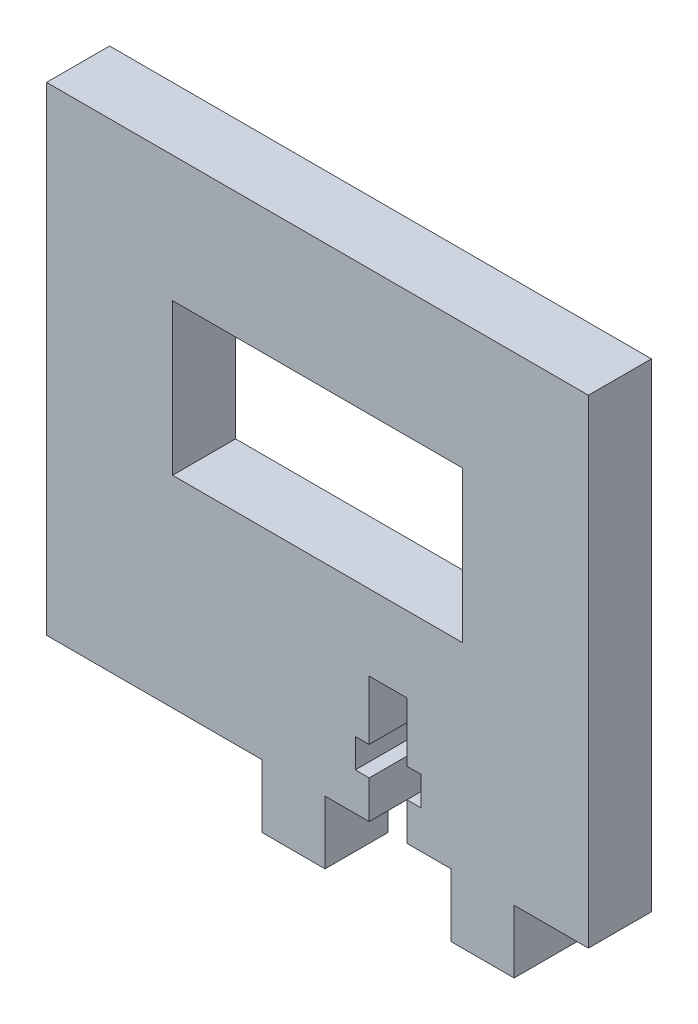
ISO-10303-21;
HEADER;
FILE_DESCRIPTION(('STEP AP214'),'2;1');
FILE_NAME('part.step','',(''),(''),'','','');
FILE_SCHEMA(('AUTOMOTIVE_DESIGN { 1 0 10303 214 1 1 1 1 }'));
ENDSEC;
DATA;
#1=APPLICATION_CONTEXT('core data for automotive mechanical design processes');
#2=APPLICATION_PROTOCOL_DEFINITION('international standard','automotive_design',2000,#1);
#3=PRODUCT_CONTEXT('',#1,'mechanical');
#4=PRODUCT('Part','Part','',(#3));
#5=PRODUCT_RELATED_PRODUCT_CATEGORY('part','',(#4));
#6=PRODUCT_DEFINITION_FORMATION('','',#4);
#7=PRODUCT_DEFINITION_CONTEXT('part definition',#1,'design');
#8=PRODUCT_DEFINITION('design','',#6,#7);
#9=PRODUCT_DEFINITION_SHAPE('','',#8);
#10=(LENGTH_UNIT() NAMED_UNIT(*) SI_UNIT(.MILLI.,.METRE.));
#11=(NAMED_UNIT(*) PLANE_ANGLE_UNIT() SI_UNIT($,.RADIAN.));
#12=(NAMED_UNIT(*) SI_UNIT($,.STERADIAN.) SOLID_ANGLE_UNIT());
#13=UNCERTAINTY_MEASURE_WITH_UNIT(LENGTH_MEASURE(1.E-05),#10,'distance_accuracy_value','');
#14=(GEOMETRIC_REPRESENTATION_CONTEXT(3) GLOBAL_UNCERTAINTY_ASSIGNED_CONTEXT((#13)) GLOBAL_UNIT_ASSIGNED_CONTEXT((#10,
#11,#12)) REPRESENTATION_CONTEXT('',''));
#15=CARTESIAN_POINT('',(0.,0.,0.));
#16=DIRECTION('',(0.,0.,1.));
#17=DIRECTION('',(1.,0.,0.));
#18=AXIS2_PLACEMENT_3D('',#15,#16,#17);
#19=CARTESIAN_POINT('',(5.9,0.,5.));
#20=DIRECTION('',(-1.,0.,0.));
#21=DIRECTION('',(0.,0.,1.));
#22=AXIS2_PLACEMENT_3D('',#19,#20,#21);
#23=PLANE('',#22);
#24=DIRECTION('',(0.,1.,0.));
#25=VECTOR('',#24,1.);
#26=CARTESIAN_POINT('',(5.9,0.,0.));
#27=LINE('',#26,#25);
#28=CARTESIAN_POINT('',(5.9,-6.,0.));
#29=VERTEX_POINT('',#28);
#30=CARTESIAN_POINT('',(5.9,6.,0.));
#31=VERTEX_POINT('',#30);
#32=EDGE_CURVE('E312',#29,#31,#27,.T.);
#33=ORIENTED_EDGE('',*,*,#32,.F.);
#34=DIRECTION('',(0.,0.,-1.));
#35=VECTOR('',#34,1.);
#36=CARTESIAN_POINT('',(5.9,-6.,5.));
#37=LINE('',#36,#35);
#38=CARTESIAN_POINT('',(5.9,-6.,5.));
#39=VERTEX_POINT('',#38);
#40=EDGE_CURVE('E11',#39,#29,#37,.T.);
#41=ORIENTED_EDGE('',*,*,#40,.F.);
#42=DIRECTION('',(0.,1.,0.));
#43=VECTOR('',#42,1.);
#44=CARTESIAN_POINT('',(5.9,0.,5.));
#45=LINE('',#44,#43);
#46=CARTESIAN_POINT('',(5.9,6.,5.));
#47=VERTEX_POINT('',#46);
#48=EDGE_CURVE('E246',#39,#47,#45,.T.);
#49=ORIENTED_EDGE('',*,*,#48,.T.);
#50=DIRECTION('',(0.,0.,-1.));
#51=VECTOR('',#50,1.);
#52=CARTESIAN_POINT('',(5.9,6.,5.));
#53=LINE('',#52,#51);
#54=EDGE_CURVE('E148',#47,#31,#53,.T.);
#55=ORIENTED_EDGE('',*,*,#54,.T.);
#56=EDGE_LOOP('',(#33,#41,#49,#55));
#57=FACE_BOUND('',#56,.T.);
#58=ADVANCED_FACE('F34',(#57),#23,.T.);
#59=CARTESIAN_POINT('',(0.,-6.,5.));
#60=DIRECTION('',(0.,1.,0.));
#61=DIRECTION('',(-1.,0.,0.));
#62=AXIS2_PLACEMENT_3D('',#59,#60,#61);
#63=PLANE('',#62);
#64=DIRECTION('',(1.,0.,0.));
#65=VECTOR('',#64,1.);
#66=CARTESIAN_POINT('',(0.,-6.,0.));
#67=LINE('',#66,#65);
#68=CARTESIAN_POINT('',(-17.1,-6.,0.));
#69=VERTEX_POINT('',#68);
#70=EDGE_CURVE('E236',#69,#29,#67,.T.);
#71=ORIENTED_EDGE('',*,*,#70,.F.);
#72=DIRECTION('',(0.,0.,-1.));
#73=VECTOR('',#72,1.);
#74=CARTESIAN_POINT('',(-17.1,-6.,5.));
#75=LINE('',#74,#73);
#76=CARTESIAN_POINT('',(-17.1,-6.,5.));
#77=VERTEX_POINT('',#76);
#78=EDGE_CURVE('E44',#77,#69,#75,.T.);
#79=ORIENTED_EDGE('',*,*,#78,.F.);
#80=DIRECTION('',(1.,0.,0.));
#81=VECTOR('',#80,1.);
#82=CARTESIAN_POINT('',(0.,-6.,5.));
#83=LINE('',#82,#81);
#84=EDGE_CURVE('E234',#77,#39,#83,.T.);
#85=ORIENTED_EDGE('',*,*,#84,.T.);
#86=ORIENTED_EDGE('',*,*,#40,.T.);
#87=EDGE_LOOP('',(#71,#79,#85,#86));
#88=FACE_BOUND('',#87,.T.);
#89=ADVANCED_FACE('F232',(#88),#63,.T.);
#90=CARTESIAN_POINT('',(-17.1,0.,5.));
#91=DIRECTION('',(-1.,0.,0.));
#92=DIRECTION('',(0.,-1.,0.));
#93=AXIS2_PLACEMENT_3D('',#90,#91,#92);
#94=PLANE('',#93);
#95=DIRECTION('',(0.,1.,0.));
#96=VECTOR('',#95,1.);
#97=CARTESIAN_POINT('',(-17.1,0.,0.));
#98=LINE('',#97,#96);
#99=CARTESIAN_POINT('',(-17.1,6.,0.));
#100=VERTEX_POINT('',#99);
#101=EDGE_CURVE('E315',#69,#100,#98,.T.);
#102=ORIENTED_EDGE('',*,*,#101,.T.);
#103=DIRECTION('',(0.,0.,-1.));
#104=VECTOR('',#103,1.);
#105=CARTESIAN_POINT('',(-17.1,6.,5.));
#106=LINE('',#105,#104);
#107=CARTESIAN_POINT('',(-17.1,6.,5.));
#108=VERTEX_POINT('',#107);
#109=EDGE_CURVE('E239',#108,#100,#106,.T.);
#110=ORIENTED_EDGE('',*,*,#109,.F.);
#111=DIRECTION('',(0.,1.,0.));
#112=VECTOR('',#111,1.);
#113=CARTESIAN_POINT('',(-17.1,0.,5.));
#114=LINE('',#113,#112);
#115=EDGE_CURVE('E242',#77,#108,#114,.T.);
#116=ORIENTED_EDGE('',*,*,#115,.F.);
#117=ORIENTED_EDGE('',*,*,#78,.T.);
#118=EDGE_LOOP('',(#102,#110,#116,#117));
#119=FACE_BOUND('',#118,.T.);
#120=ADVANCED_FACE('F243',(#119),#94,.F.);
#121=CARTESIAN_POINT('',(0.,-27.,5.));
#122=DIRECTION('',(0.,-1.,0.));
#123=DIRECTION('',(0.,0.,-1.));
#124=AXIS2_PLACEMENT_3D('',#121,#122,#123);
#125=PLANE('',#124);
#126=DIRECTION('',(-1.,0.,0.));
#127=VECTOR('',#126,1.);
#128=CARTESIAN_POINT('',(0.,-27.,0.));
#129=LINE('',#128,#127);
#130=CARTESIAN_POINT('',(-5.,-27.,0.));
#131=VERTEX_POINT('',#130);
#132=CARTESIAN_POINT('',(-10.,-27.,0.));
#133=VERTEX_POINT('',#132);
#134=EDGE_CURVE('E254',#131,#133,#129,.T.);
#135=ORIENTED_EDGE('',*,*,#134,.F.);
#136=DIRECTION('',(0.,0.,-1.));
#137=VECTOR('',#136,1.);
#138=CARTESIAN_POINT('',(-5.,-27.,5.));
#139=LINE('',#138,#137);
#140=CARTESIAN_POINT('',(-5.,-27.,5.));
#141=VERTEX_POINT('',#140);
#142=EDGE_CURVE('E38',#141,#131,#139,.T.);
#143=ORIENTED_EDGE('',*,*,#142,.F.);
#144=DIRECTION('',(-1.,0.,0.));
#145=VECTOR('',#144,1.);
#146=CARTESIAN_POINT('',(0.,-27.,5.));
#147=LINE('',#146,#145);
#148=CARTESIAN_POINT('',(-10.,-27.,5.));
#149=VERTEX_POINT('',#148);
#150=EDGE_CURVE('E318',#141,#149,#147,.T.);
#151=ORIENTED_EDGE('',*,*,#150,.T.);
#152=DIRECTION('',(0.,0.,-1.));
#153=VECTOR('',#152,1.);
#154=CARTESIAN_POINT('',(-10.,-27.,5.));
#155=LINE('',#154,#153);
#156=EDGE_CURVE('E253',#149,#133,#155,.T.);
#157=ORIENTED_EDGE('',*,*,#156,.T.);
#158=EDGE_LOOP('',(#135,#143,#151,#157));
#159=FACE_BOUND('',#158,.T.);
#160=ADVANCED_FACE('F36',(#159),#125,.T.);
#161=CARTESIAN_POINT('',(-5.,0.,5.));
#162=DIRECTION('',(-1.,0.,0.));
#163=DIRECTION('',(0.,-1.,0.));
#164=AXIS2_PLACEMENT_3D('',#161,#162,#163);
#165=PLANE('',#164);
#166=DIRECTION('',(0.,1.,0.));
#167=VECTOR('',#166,1.);
#168=CARTESIAN_POINT('',(-5.,0.,0.));
#169=LINE('',#168,#167);
#170=CARTESIAN_POINT('',(-5.,-22.,0.));
#171=VERTEX_POINT('',#170);
#172=EDGE_CURVE('E257',#131,#171,#169,.T.);
#173=ORIENTED_EDGE('',*,*,#172,.T.);
#174=DIRECTION('',(0.,0.,-1.));
#175=VECTOR('',#174,1.);
#176=CARTESIAN_POINT('',(-5.,-22.,5.));
#177=LINE('',#176,#175);
#178=CARTESIAN_POINT('',(-5.,-22.,5.));
#179=VERTEX_POINT('',#178);
#180=EDGE_CURVE('E372',#179,#171,#177,.T.);
#181=ORIENTED_EDGE('',*,*,#180,.F.);
#182=DIRECTION('',(0.,1.,0.));
#183=VECTOR('',#182,1.);
#184=CARTESIAN_POINT('',(-5.,0.,5.));
#185=LINE('',#184,#183);
#186=EDGE_CURVE('E381',#141,#179,#185,.T.);
#187=ORIENTED_EDGE('',*,*,#186,.F.);
#188=ORIENTED_EDGE('',*,*,#142,.T.);
#189=EDGE_LOOP('',(#173,#181,#187,#188));
#190=FACE_BOUND('',#189,.T.);
#191=ADVANCED_FACE('F380',(#190),#165,.F.);
#192=CARTESIAN_POINT('',(0.,-22.,5.));
#193=DIRECTION('',(0.,1.,0.));
#194=DIRECTION('',(0.,0.,1.));
#195=AXIS2_PLACEMENT_3D('',#192,#193,#194);
#196=PLANE('',#195);
#197=DIRECTION('',(1.,0.,0.));
#198=VECTOR('',#197,1.);
#199=CARTESIAN_POINT('',(0.,-22.,0.));
#200=LINE('',#199,#198);
#201=CARTESIAN_POINT('',(-1.5,-22.,0.));
#202=VERTEX_POINT('',#201);
#203=EDGE_CURVE('E259',#171,#202,#200,.T.);
#204=ORIENTED_EDGE('',*,*,#203,.T.);
#205=DIRECTION('',(0.,0.,-1.));
#206=VECTOR('',#205,1.);
#207=CARTESIAN_POINT('',(-1.5,-22.,5.));
#208=LINE('',#207,#206);
#209=CARTESIAN_POINT('',(-1.5,-22.,5.));
#210=VERTEX_POINT('',#209);
#211=EDGE_CURVE('E371',#210,#202,#208,.T.);
#212=ORIENTED_EDGE('',*,*,#211,.F.);
#213=DIRECTION('',(1.,0.,0.));
#214=VECTOR('',#213,1.);
#215=CARTESIAN_POINT('',(0.,-22.,5.));
#216=LINE('',#215,#214);
#217=EDGE_CURVE('E453',#179,#210,#216,.T.);
#218=ORIENTED_EDGE('',*,*,#217,.F.);
#219=ORIENTED_EDGE('',*,*,#180,.T.);
#220=EDGE_LOOP('',(#204,#212,#218,#219));
#221=FACE_BOUND('',#220,.T.);
#222=ADVANCED_FACE('F551',(#221),#196,.F.);
#223=CARTESIAN_POINT('',(-1.50000000000001,0.,5.));
#224=DIRECTION('',(1.,0.,0.));
#225=DIRECTION('',(0.,1.,0.));
#226=AXIS2_PLACEMENT_3D('',#223,#224,#225);
#227=PLANE('',#226);
#228=DIRECTION('',(0.,-1.,0.));
#229=VECTOR('',#228,1.);
#230=CARTESIAN_POINT('',(-1.50000000000001,0.,0.));
#231=LINE('',#230,#229);
#232=CARTESIAN_POINT('',(-1.5,-19.,0.));
#233=VERTEX_POINT('',#232);
#234=EDGE_CURVE('E262',#233,#202,#231,.T.);
#235=ORIENTED_EDGE('',*,*,#234,.F.);
#236=DIRECTION('',(0.,0.,-1.));
#237=VECTOR('',#236,1.);
#238=CARTESIAN_POINT('',(-1.5,-19.,5.));
#239=LINE('',#238,#237);
#240=CARTESIAN_POINT('',(-1.5,-19.,5.));
#241=VERTEX_POINT('',#240);
#242=EDGE_CURVE('E369',#241,#233,#239,.T.);
#243=ORIENTED_EDGE('',*,*,#242,.F.);
#244=DIRECTION('',(0.,-1.,0.));
#245=VECTOR('',#244,1.);
#246=CARTESIAN_POINT('',(-1.50000000000001,0.,5.));
#247=LINE('',#246,#245);
#248=EDGE_CURVE('E456',#241,#210,#247,.T.);
#249=ORIENTED_EDGE('',*,*,#248,.T.);
#250=ORIENTED_EDGE('',*,*,#211,.T.);
#251=EDGE_LOOP('',(#235,#243,#249,#250));
#252=FACE_BOUND('',#251,.T.);
#253=ADVANCED_FACE('F739',(#252),#227,.T.);
#254=CARTESIAN_POINT('',(-1.19853621976579E-13,-19.,5.));
#255=DIRECTION('',(0.,-1.,0.));
#256=DIRECTION('',(1.,0.,0.));
#257=AXIS2_PLACEMENT_3D('',#254,#255,#256);
#258=PLANE('',#257);
#259=DIRECTION('',(-1.,0.,0.));
#260=VECTOR('',#259,1.);
#261=CARTESIAN_POINT('',(-1.19853621976579E-13,-19.,0.));
#262=LINE('',#261,#260);
#263=CARTESIAN_POINT('',(-2.6,-19.,0.));
#264=VERTEX_POINT('',#263);
#265=EDGE_CURVE('E267',#233,#264,#262,.T.);
#266=ORIENTED_EDGE('',*,*,#265,.T.);
#267=DIRECTION('',(0.,0.,-1.));
#268=VECTOR('',#267,1.);
#269=CARTESIAN_POINT('',(-2.6,-19.,5.));
#270=LINE('',#269,#268);
#271=CARTESIAN_POINT('',(-2.6,-19.,5.));
#272=VERTEX_POINT('',#271);
#273=EDGE_CURVE('E366',#272,#264,#270,.T.);
#274=ORIENTED_EDGE('',*,*,#273,.F.);
#275=DIRECTION('',(-1.,0.,0.));
#276=VECTOR('',#275,1.);
#277=CARTESIAN_POINT('',(-1.19853621976579E-13,-19.,5.));
#278=LINE('',#277,#276);
#279=EDGE_CURVE('E460',#241,#272,#278,.T.);
#280=ORIENTED_EDGE('',*,*,#279,.F.);
#281=ORIENTED_EDGE('',*,*,#242,.T.);
#282=EDGE_LOOP('',(#266,#274,#280,#281));
#283=FACE_BOUND('',#282,.T.);
#284=ADVANCED_FACE('F491',(#283),#258,.F.);
#285=CARTESIAN_POINT('',(-2.60000000000001,0.,5.));
#286=DIRECTION('',(-1.,0.,0.));
#287=DIRECTION('',(0.,-1.,0.));
#288=AXIS2_PLACEMENT_3D('',#285,#286,#287);
#289=PLANE('',#288);
#290=DIRECTION('',(0.,1.,0.));
#291=VECTOR('',#290,1.);
#292=CARTESIAN_POINT('',(-2.60000000000001,0.,0.));
#293=LINE('',#292,#291);
#294=CARTESIAN_POINT('',(-2.6,-16.7,0.));
#295=VERTEX_POINT('',#294);
#296=EDGE_CURVE('E269',#264,#295,#293,.T.);
#297=ORIENTED_EDGE('',*,*,#296,.T.);
#298=DIRECTION('',(0.,0.,-1.));
#299=VECTOR('',#298,1.);
#300=CARTESIAN_POINT('',(-2.6,-16.7,5.));
#301=LINE('',#300,#299);
#302=CARTESIAN_POINT('',(-2.6,-16.7,5.));
#303=VERTEX_POINT('',#302);
#304=EDGE_CURVE('E363',#303,#295,#301,.T.);
#305=ORIENTED_EDGE('',*,*,#304,.F.);
#306=DIRECTION('',(0.,1.,0.));
#307=VECTOR('',#306,1.);
#308=CARTESIAN_POINT('',(-2.60000000000001,0.,5.));
#309=LINE('',#308,#307);
#310=EDGE_CURVE('E484',#272,#303,#309,.T.);
#311=ORIENTED_EDGE('',*,*,#310,.F.);
#312=ORIENTED_EDGE('',*,*,#273,.T.);
#313=EDGE_LOOP('',(#297,#305,#311,#312));
#314=FACE_BOUND('',#313,.T.);
#315=ADVANCED_FACE('F495',(#314),#289,.F.);
#316=CARTESIAN_POINT('',(0.,-16.7,5.));
#317=DIRECTION('',(0.,1.,0.));
#318=DIRECTION('',(-1.,0.,0.));
#319=AXIS2_PLACEMENT_3D('',#316,#317,#318);
#320=PLANE('',#319);
#321=DIRECTION('',(1.,0.,0.));
#322=VECTOR('',#321,1.);
#323=CARTESIAN_POINT('',(0.,-16.7,0.));
#324=LINE('',#323,#322);
#325=CARTESIAN_POINT('',(-1.5,-16.7,0.));
#326=VERTEX_POINT('',#325);
#327=EDGE_CURVE('E271',#295,#326,#324,.T.);
#328=ORIENTED_EDGE('',*,*,#327,.T.);
#329=DIRECTION('',(0.,0.,-1.));
#330=VECTOR('',#329,1.);
#331=CARTESIAN_POINT('',(-1.5,-16.7,5.));
#332=LINE('',#331,#330);
#333=CARTESIAN_POINT('',(-1.5,-16.7,5.));
#334=VERTEX_POINT('',#333);
#335=EDGE_CURVE('E361',#334,#326,#332,.T.);
#336=ORIENTED_EDGE('',*,*,#335,.F.);
#337=DIRECTION('',(1.,0.,0.));
#338=VECTOR('',#337,1.);
#339=CARTESIAN_POINT('',(0.,-16.7,5.));
#340=LINE('',#339,#338);
#341=EDGE_CURVE('E482',#303,#334,#340,.T.);
#342=ORIENTED_EDGE('',*,*,#341,.F.);
#343=ORIENTED_EDGE('',*,*,#304,.T.);
#344=EDGE_LOOP('',(#328,#336,#342,#343));
#345=FACE_BOUND('',#344,.T.);
#346=ADVANCED_FACE('F500',(#345),#320,.F.);
#347=CARTESIAN_POINT('',(-1.50000000000001,0.,5.));
#348=DIRECTION('',(1.,0.,0.));
#349=DIRECTION('',(0.,1.,0.));
#350=AXIS2_PLACEMENT_3D('',#347,#348,#349);
#351=PLANE('',#350);
#352=DIRECTION('',(0.,-1.,0.));
#353=VECTOR('',#352,1.);
#354=CARTESIAN_POINT('',(-1.50000000000001,0.,0.));
#355=LINE('',#354,#353);
#356=CARTESIAN_POINT('',(-1.5,-12.,0.));
#357=VERTEX_POINT('',#356);
#358=EDGE_CURVE('E274',#357,#326,#355,.T.);
#359=ORIENTED_EDGE('',*,*,#358,.F.);
#360=DIRECTION('',(0.,0.,-1.));
#361=VECTOR('',#360,1.);
#362=CARTESIAN_POINT('',(-1.5,-12.,5.));
#363=LINE('',#362,#361);
#364=CARTESIAN_POINT('',(-1.5,-12.,5.));
#365=VERTEX_POINT('',#364);
#366=EDGE_CURVE('E359',#365,#357,#363,.T.);
#367=ORIENTED_EDGE('',*,*,#366,.F.);
#368=DIRECTION('',(0.,-1.,0.));
#369=VECTOR('',#368,1.);
#370=CARTESIAN_POINT('',(-1.50000000000001,0.,5.));
#371=LINE('',#370,#369);
#372=EDGE_CURVE('E479',#365,#334,#371,.T.);
#373=ORIENTED_EDGE('',*,*,#372,.T.);
#374=ORIENTED_EDGE('',*,*,#335,.T.);
#375=EDGE_LOOP('',(#359,#367,#373,#374));
#376=FACE_BOUND('',#375,.T.);
#377=ADVANCED_FACE('F528',(#376),#351,.T.);
#378=CARTESIAN_POINT('',(0.,-12.,5.));
#379=DIRECTION('',(0.,-1.,0.));
#380=DIRECTION('',(0.,0.,-1.));
#381=AXIS2_PLACEMENT_3D('',#378,#379,#380);
#382=PLANE('',#381);
#383=DIRECTION('',(-1.,0.,0.));
#384=VECTOR('',#383,1.);
#385=CARTESIAN_POINT('',(0.,-12.,0.));
#386=LINE('',#385,#384);
#387=CARTESIAN_POINT('',(1.5,-12.,0.));
#388=VERTEX_POINT('',#387);
#389=EDGE_CURVE('E277',#388,#357,#386,.T.);
#390=ORIENTED_EDGE('',*,*,#389,.F.);
#391=DIRECTION('',(0.,0.,-1.));
#392=VECTOR('',#391,1.);
#393=CARTESIAN_POINT('',(1.5,-12.,5.));
#394=LINE('',#393,#392);
#395=CARTESIAN_POINT('',(1.5,-12.,5.));
#396=VERTEX_POINT('',#395);
#397=EDGE_CURVE('E357',#396,#388,#394,.T.);
#398=ORIENTED_EDGE('',*,*,#397,.F.);
#399=DIRECTION('',(-1.,0.,0.));
#400=VECTOR('',#399,1.);
#401=CARTESIAN_POINT('',(0.,-12.,5.));
#402=LINE('',#401,#400);
#403=EDGE_CURVE('E476',#396,#365,#402,.T.);
#404=ORIENTED_EDGE('',*,*,#403,.T.);
#405=ORIENTED_EDGE('',*,*,#366,.T.);
#406=EDGE_LOOP('',(#390,#398,#404,#405));
#407=FACE_BOUND('',#406,.T.);
#408=ADVANCED_FACE('F507',(#407),#382,.T.);
#409=CARTESIAN_POINT('',(1.5,0.,5.));
#410=DIRECTION('',(-1.,0.,0.));
#411=DIRECTION('',(0.,-1.,0.));
#412=AXIS2_PLACEMENT_3D('',#409,#410,#411);
#413=PLANE('',#412);
#414=DIRECTION('',(0.,1.,0.));
#415=VECTOR('',#414,1.);
#416=CARTESIAN_POINT('',(1.5,0.,0.));
#417=LINE('',#416,#415);
#418=CARTESIAN_POINT('',(1.5,-16.7,0.));
#419=VERTEX_POINT('',#418);
#420=EDGE_CURVE('E280',#419,#388,#417,.T.);
#421=ORIENTED_EDGE('',*,*,#420,.F.);
#422=DIRECTION('',(0.,0.,-1.));
#423=VECTOR('',#422,1.);
#424=CARTESIAN_POINT('',(1.5,-16.7,5.));
#425=LINE('',#424,#423);
#426=CARTESIAN_POINT('',(1.5,-16.7,5.));
#427=VERTEX_POINT('',#426);
#428=EDGE_CURVE('E355',#427,#419,#425,.T.);
#429=ORIENTED_EDGE('',*,*,#428,.F.);
#430=DIRECTION('',(0.,1.,0.));
#431=VECTOR('',#430,1.);
#432=CARTESIAN_POINT('',(1.5,0.,5.));
#433=LINE('',#432,#431);
#434=EDGE_CURVE('E473',#427,#396,#433,.T.);
#435=ORIENTED_EDGE('',*,*,#434,.T.);
#436=ORIENTED_EDGE('',*,*,#397,.T.);
#437=EDGE_LOOP('',(#421,#429,#435,#436));
#438=FACE_BOUND('',#437,.T.);
#439=ADVANCED_FACE('F511',(#438),#413,.T.);
#440=CARTESIAN_POINT('',(0.,-16.7,5.));
#441=DIRECTION('',(0.,1.,0.));
#442=DIRECTION('',(-1.,0.,0.));
#443=AXIS2_PLACEMENT_3D('',#440,#441,#442);
#444=PLANE('',#443);
#445=DIRECTION('',(1.,0.,0.));
#446=VECTOR('',#445,1.);
#447=CARTESIAN_POINT('',(0.,-16.7,0.));
#448=LINE('',#447,#446);
#449=CARTESIAN_POINT('',(2.6,-16.7,0.));
#450=VERTEX_POINT('',#449);
#451=EDGE_CURVE('E283',#419,#450,#448,.T.);
#452=ORIENTED_EDGE('',*,*,#451,.T.);
#453=DIRECTION('',(0.,0.,-1.));
#454=VECTOR('',#453,1.);
#455=CARTESIAN_POINT('',(2.6,-16.7,5.));
#456=LINE('',#455,#454);
#457=CARTESIAN_POINT('',(2.6,-16.7,5.));
#458=VERTEX_POINT('',#457);
#459=EDGE_CURVE('E352',#458,#450,#456,.T.);
#460=ORIENTED_EDGE('',*,*,#459,.F.);
#461=DIRECTION('',(1.,0.,0.));
#462=VECTOR('',#461,1.);
#463=CARTESIAN_POINT('',(0.,-16.7,5.));
#464=LINE('',#463,#462);
#465=EDGE_CURVE('E471',#427,#458,#464,.T.);
#466=ORIENTED_EDGE('',*,*,#465,.F.);
#467=ORIENTED_EDGE('',*,*,#428,.T.);
#468=EDGE_LOOP('',(#452,#460,#466,#467));
#469=FACE_BOUND('',#468,.T.);
#470=ADVANCED_FACE('F517',(#469),#444,.F.);
#471=CARTESIAN_POINT('',(2.60000000000001,0.,5.));
#472=DIRECTION('',(1.,0.,0.));
#473=DIRECTION('',(0.,1.,0.));
#474=AXIS2_PLACEMENT_3D('',#471,#472,#473);
#475=PLANE('',#474);
#476=DIRECTION('',(0.,-1.,0.));
#477=VECTOR('',#476,1.);
#478=CARTESIAN_POINT('',(2.60000000000001,0.,0.));
#479=LINE('',#478,#477);
#480=CARTESIAN_POINT('',(2.6,-19.,0.));
#481=VERTEX_POINT('',#480);
#482=EDGE_CURVE('E285',#450,#481,#479,.T.);
#483=ORIENTED_EDGE('',*,*,#482,.T.);
#484=DIRECTION('',(0.,0.,-1.));
#485=VECTOR('',#484,1.);
#486=CARTESIAN_POINT('',(2.6,-19.,5.));
#487=LINE('',#486,#485);
#488=CARTESIAN_POINT('',(2.6,-19.,5.));
#489=VERTEX_POINT('',#488);
#490=EDGE_CURVE('E349',#489,#481,#487,.T.);
#491=ORIENTED_EDGE('',*,*,#490,.F.);
#492=DIRECTION('',(0.,-1.,0.));
#493=VECTOR('',#492,1.);
#494=CARTESIAN_POINT('',(2.60000000000001,0.,5.));
#495=LINE('',#494,#493);
#496=EDGE_CURVE('E467',#458,#489,#495,.T.);
#497=ORIENTED_EDGE('',*,*,#496,.F.);
#498=ORIENTED_EDGE('',*,*,#459,.T.);
#499=EDGE_LOOP('',(#483,#491,#497,#498));
#500=FACE_BOUND('',#499,.T.);
#501=ADVANCED_FACE('F521',(#500),#475,.F.);
#502=CARTESIAN_POINT('',(0.,-19.,5.));
#503=DIRECTION('',(0.,-1.,0.));
#504=DIRECTION('',(0.,0.,-1.));
#505=AXIS2_PLACEMENT_3D('',#502,#503,#504);
#506=PLANE('',#505);
#507=DIRECTION('',(-1.,0.,0.));
#508=VECTOR('',#507,1.);
#509=CARTESIAN_POINT('',(0.,-19.,0.));
#510=LINE('',#509,#508);
#511=CARTESIAN_POINT('',(1.5,-19.,0.));
#512=VERTEX_POINT('',#511);
#513=EDGE_CURVE('E287',#481,#512,#510,.T.);
#514=ORIENTED_EDGE('',*,*,#513,.T.);
#515=DIRECTION('',(0.,0.,-1.));
#516=VECTOR('',#515,1.);
#517=CARTESIAN_POINT('',(1.5,-19.,5.));
#518=LINE('',#517,#516);
#519=CARTESIAN_POINT('',(1.5,-19.,5.));
#520=VERTEX_POINT('',#519);
#521=EDGE_CURVE('E347',#520,#512,#518,.T.);
#522=ORIENTED_EDGE('',*,*,#521,.F.);
#523=DIRECTION('',(-1.,0.,0.));
#524=VECTOR('',#523,1.);
#525=CARTESIAN_POINT('',(0.,-19.,5.));
#526=LINE('',#525,#524);
#527=EDGE_CURVE('E464',#489,#520,#526,.T.);
#528=ORIENTED_EDGE('',*,*,#527,.F.);
#529=ORIENTED_EDGE('',*,*,#490,.T.);
#530=EDGE_LOOP('',(#514,#522,#528,#529));
#531=FACE_BOUND('',#530,.T.);
#532=ADVANCED_FACE('F526',(#531),#506,.F.);
#533=CARTESIAN_POINT('',(1.5,0.,5.));
#534=DIRECTION('',(-1.,0.,0.));
#535=DIRECTION('',(0.,0.,1.));
#536=AXIS2_PLACEMENT_3D('',#533,#534,#535);
#537=PLANE('',#536);
#538=DIRECTION('',(0.,1.,0.));
#539=VECTOR('',#538,1.);
#540=CARTESIAN_POINT('',(1.5,0.,0.));
#541=LINE('',#540,#539);
#542=CARTESIAN_POINT('',(1.5,-22.,0.));
#543=VERTEX_POINT('',#542);
#544=EDGE_CURVE('E290',#543,#512,#541,.T.);
#545=ORIENTED_EDGE('',*,*,#544,.F.);
#546=DIRECTION('',(0.,0.,-1.));
#547=VECTOR('',#546,1.);
#548=CARTESIAN_POINT('',(1.5,-22.,5.));
#549=LINE('',#548,#547);
#550=CARTESIAN_POINT('',(1.5,-22.,5.));
#551=VERTEX_POINT('',#550);
#552=EDGE_CURVE('E345',#551,#543,#549,.T.);
#553=ORIENTED_EDGE('',*,*,#552,.F.);
#554=DIRECTION('',(0.,1.,0.));
#555=VECTOR('',#554,1.);
#556=CARTESIAN_POINT('',(1.5,0.,5.));
#557=LINE('',#556,#555);
#558=EDGE_CURVE('E461',#551,#520,#557,.T.);
#559=ORIENTED_EDGE('',*,*,#558,.T.);
#560=ORIENTED_EDGE('',*,*,#521,.T.);
#561=EDGE_LOOP('',(#545,#553,#559,#560));
#562=FACE_BOUND('',#561,.T.);
#563=ADVANCED_FACE('F527',(#562),#537,.T.);
#564=CARTESIAN_POINT('',(5.,-22.,0.));
#565=VERTEX_POINT('',#564);
#566=EDGE_CURVE('E264',#543,#565,#200,.T.);
#567=ORIENTED_EDGE('',*,*,#566,.T.);
#568=DIRECTION('',(0.,0.,-1.));
#569=VECTOR('',#568,1.);
#570=CARTESIAN_POINT('',(5.,-22.,5.));
#571=LINE('',#570,#569);
#572=CARTESIAN_POINT('',(5.,-22.,5.));
#573=VERTEX_POINT('',#572);
#574=EDGE_CURVE('E342',#573,#565,#571,.T.);
#575=ORIENTED_EDGE('',*,*,#574,.F.);
#576=EDGE_CURVE('E445',#551,#573,#216,.T.);
#577=ORIENTED_EDGE('',*,*,#576,.F.);
#578=ORIENTED_EDGE('',*,*,#552,.T.);
#579=EDGE_LOOP('',(#567,#575,#577,#578));
#580=FACE_BOUND('',#579,.T.);
#581=ADVANCED_FACE('F423',(#580),#196,.F.);
#582=CARTESIAN_POINT('',(5.,0.,5.));
#583=DIRECTION('',(1.,0.,0.));
#584=DIRECTION('',(0.,1.,0.));
#585=AXIS2_PLACEMENT_3D('',#582,#583,#584);
#586=PLANE('',#585);
#587=DIRECTION('',(0.,-1.,0.));
#588=VECTOR('',#587,1.);
#589=CARTESIAN_POINT('',(5.,0.,0.));
#590=LINE('',#589,#588);
#591=CARTESIAN_POINT('',(5.,-27.,0.));
#592=VERTEX_POINT('',#591);
#593=EDGE_CURVE('E293',#565,#592,#590,.T.);
#594=ORIENTED_EDGE('',*,*,#593,.T.);
#595=DIRECTION('',(0.,0.,-1.));
#596=VECTOR('',#595,1.);
#597=CARTESIAN_POINT('',(5.,-27.,5.));
#598=LINE('',#597,#596);
#599=CARTESIAN_POINT('',(5.,-27.,5.));
#600=VERTEX_POINT('',#599);
#601=EDGE_CURVE('E339',#600,#592,#598,.T.);
#602=ORIENTED_EDGE('',*,*,#601,.F.);
#603=DIRECTION('',(0.,-1.,0.));
#604=VECTOR('',#603,1.);
#605=CARTESIAN_POINT('',(5.,0.,5.));
#606=LINE('',#605,#604);
#607=EDGE_CURVE('E431',#573,#600,#606,.T.);
#608=ORIENTED_EDGE('',*,*,#607,.F.);
#609=ORIENTED_EDGE('',*,*,#574,.T.);
#610=EDGE_LOOP('',(#594,#602,#608,#609));
#611=FACE_BOUND('',#610,.T.);
#612=ADVANCED_FACE('F429',(#611),#586,.F.);
#613=CARTESIAN_POINT('',(0.,-27.,5.));
#614=DIRECTION('',(0.,1.,0.));
#615=DIRECTION('',(0.,0.,1.));
#616=AXIS2_PLACEMENT_3D('',#613,#614,#615);
#617=PLANE('',#616);
#618=DIRECTION('',(1.,0.,0.));
#619=VECTOR('',#618,1.);
#620=CARTESIAN_POINT('',(0.,-27.,0.));
#621=LINE('',#620,#619);
#622=CARTESIAN_POINT('',(10.,-27.,0.));
#623=VERTEX_POINT('',#622);
#624=EDGE_CURVE('E295',#592,#623,#621,.T.);
#625=ORIENTED_EDGE('',*,*,#624,.T.);
#626=DIRECTION('',(0.,0.,-1.));
#627=VECTOR('',#626,1.);
#628=CARTESIAN_POINT('',(10.,-27.,5.));
#629=LINE('',#628,#627);
#630=CARTESIAN_POINT('',(10.,-27.,5.));
#631=VERTEX_POINT('',#630);
#632=EDGE_CURVE('E336',#631,#623,#629,.T.);
#633=ORIENTED_EDGE('',*,*,#632,.F.);
#634=DIRECTION('',(1.,0.,0.));
#635=VECTOR('',#634,1.);
#636=CARTESIAN_POINT('',(0.,-27.,5.));
#637=LINE('',#636,#635);
#638=EDGE_CURVE('E442',#600,#631,#637,.T.);
#639=ORIENTED_EDGE('',*,*,#638,.F.);
#640=ORIENTED_EDGE('',*,*,#601,.T.);
#641=EDGE_LOOP('',(#625,#633,#639,#640));
#642=FACE_BOUND('',#641,.T.);
#643=ADVANCED_FACE('F435',(#642),#617,.F.);
#644=CARTESIAN_POINT('',(10.,0.,5.));
#645=DIRECTION('',(-1.,0.,0.));
#646=DIRECTION('',(0.,0.,1.));
#647=AXIS2_PLACEMENT_3D('',#644,#645,#646);
#648=PLANE('',#647);
#649=DIRECTION('',(0.,1.,0.));
#650=VECTOR('',#649,1.);
#651=CARTESIAN_POINT('',(10.,0.,0.));
#652=LINE('',#651,#650);
#653=CARTESIAN_POINT('',(10.,-22.,0.));
#654=VERTEX_POINT('',#653);
#655=EDGE_CURVE('E297',#623,#654,#652,.T.);
#656=ORIENTED_EDGE('',*,*,#655,.T.);
#657=DIRECTION('',(0.,0.,-1.));
#658=VECTOR('',#657,1.);
#659=CARTESIAN_POINT('',(10.,-22.,5.));
#660=LINE('',#659,#658);
#661=CARTESIAN_POINT('',(10.,-22.,5.));
#662=VERTEX_POINT('',#661);
#663=EDGE_CURVE('E333',#662,#654,#660,.T.);
#664=ORIENTED_EDGE('',*,*,#663,.F.);
#665=DIRECTION('',(0.,1.,0.));
#666=VECTOR('',#665,1.);
#667=CARTESIAN_POINT('',(10.,0.,5.));
#668=LINE('',#667,#666);
#669=EDGE_CURVE('E440',#631,#662,#668,.T.);
#670=ORIENTED_EDGE('',*,*,#669,.F.);
#671=ORIENTED_EDGE('',*,*,#632,.T.);
#672=EDGE_LOOP('',(#656,#664,#670,#671));
#673=FACE_BOUND('',#672,.T.);
#674=ADVANCED_FACE('F439',(#673),#648,.F.);
#675=CARTESIAN_POINT('',(15.9,-22.,0.));
#676=VERTEX_POINT('',#675);
#677=EDGE_CURVE('E299',#654,#676,#200,.T.);
#678=ORIENTED_EDGE('',*,*,#677,.T.);
#679=DIRECTION('',(0.,0.,-1.));
#680=VECTOR('',#679,1.);
#681=CARTESIAN_POINT('',(15.9,-22.,5.));
#682=LINE('',#681,#680);
#683=CARTESIAN_POINT('',(15.9,-22.,5.));
#684=VERTEX_POINT('',#683);
#685=EDGE_CURVE('E330',#684,#676,#682,.T.);
#686=ORIENTED_EDGE('',*,*,#685,.F.);
#687=EDGE_CURVE('E418',#662,#684,#216,.T.);
#688=ORIENTED_EDGE('',*,*,#687,.F.);
#689=ORIENTED_EDGE('',*,*,#663,.T.);
#690=EDGE_LOOP('',(#678,#686,#688,#689));
#691=FACE_BOUND('',#690,.T.);
#692=ADVANCED_FACE('F417',(#691),#196,.F.);
#693=CARTESIAN_POINT('',(15.9,0.,5.));
#694=DIRECTION('',(-1.,0.,0.));
#695=DIRECTION('',(0.,0.,1.));
#696=AXIS2_PLACEMENT_3D('',#693,#694,#695);
#697=PLANE('',#696);
#698=DIRECTION('',(0.,1.,0.));
#699=VECTOR('',#698,1.);
#700=CARTESIAN_POINT('',(15.9,0.,0.));
#701=LINE('',#700,#699);
#702=CARTESIAN_POINT('',(15.9,16.,0.));
#703=VERTEX_POINT('',#702);
#704=EDGE_CURVE('E300',#676,#703,#701,.T.);
#705=ORIENTED_EDGE('',*,*,#704,.T.);
#706=DIRECTION('',(0.,0.,-1.));
#707=VECTOR('',#706,1.);
#708=CARTESIAN_POINT('',(15.9,16.,5.));
#709=LINE('',#708,#707);
#710=CARTESIAN_POINT('',(15.9,16.,5.));
#711=VERTEX_POINT('',#710);
#712=EDGE_CURVE('E328',#711,#703,#709,.T.);
#713=ORIENTED_EDGE('',*,*,#712,.F.);
#714=DIRECTION('',(0.,1.,0.));
#715=VECTOR('',#714,1.);
#716=CARTESIAN_POINT('',(15.9,0.,5.));
#717=LINE('',#716,#715);
#718=EDGE_CURVE('E414',#684,#711,#717,.T.);
#719=ORIENTED_EDGE('',*,*,#718,.F.);
#720=ORIENTED_EDGE('',*,*,#685,.T.);
#721=EDGE_LOOP('',(#705,#713,#719,#720));
#722=FACE_BOUND('',#721,.T.);
#723=ADVANCED_FACE('F411',(#722),#697,.F.);
#724=CARTESIAN_POINT('',(0.,16.,5.));
#725=DIRECTION('',(0.,1.,0.));
#726=DIRECTION('',(0.,0.,1.));
#727=AXIS2_PLACEMENT_3D('',#724,#725,#726);
#728=PLANE('',#727);
#729=DIRECTION('',(1.,0.,0.));
#730=VECTOR('',#729,1.);
#731=CARTESIAN_POINT('',(0.,16.,0.));
#732=LINE('',#731,#730);
#733=CARTESIAN_POINT('',(-27.1,16.,0.));
#734=VERTEX_POINT('',#733);
#735=EDGE_CURVE('E303',#734,#703,#732,.T.);
#736=ORIENTED_EDGE('',*,*,#735,.F.);
#737=DIRECTION('',(0.,0.,-1.));
#738=VECTOR('',#737,1.);
#739=CARTESIAN_POINT('',(-27.1,16.,5.));
#740=LINE('',#739,#738);
#741=CARTESIAN_POINT('',(-27.1,16.,5.));
#742=VERTEX_POINT('',#741);
#743=EDGE_CURVE('E326',#742,#734,#740,.T.);
#744=ORIENTED_EDGE('',*,*,#743,.F.);
#745=DIRECTION('',(1.,0.,0.));
#746=VECTOR('',#745,1.);
#747=CARTESIAN_POINT('',(0.,16.,5.));
#748=LINE('',#747,#746);
#749=EDGE_CURVE('E451',#742,#711,#748,.T.);
#750=ORIENTED_EDGE('',*,*,#749,.T.);
#751=ORIENTED_EDGE('',*,*,#712,.T.);
#752=EDGE_LOOP('',(#736,#744,#750,#751));
#753=FACE_BOUND('',#752,.T.);
#754=ADVANCED_FACE('F405',(#753),#728,.T.);
#755=CARTESIAN_POINT('',(-27.1,0.,5.));
#756=DIRECTION('',(-1.,0.,0.));
#757=DIRECTION('',(0.,0.,1.));
#758=AXIS2_PLACEMENT_3D('',#755,#756,#757);
#759=PLANE('',#758);
#760=DIRECTION('',(0.,1.,0.));
#761=VECTOR('',#760,1.);
#762=CARTESIAN_POINT('',(-27.1,0.,0.));
#763=LINE('',#762,#761);
#764=CARTESIAN_POINT('',(-27.1,-22.,0.));
#765=VERTEX_POINT('',#764);
#766=EDGE_CURVE('E306',#765,#734,#763,.T.);
#767=ORIENTED_EDGE('',*,*,#766,.F.);
#768=DIRECTION('',(0.,0.,-1.));
#769=VECTOR('',#768,1.);
#770=CARTESIAN_POINT('',(-27.1,-22.,5.));
#771=LINE('',#770,#769);
#772=CARTESIAN_POINT('',(-27.1,-22.,5.));
#773=VERTEX_POINT('',#772);
#774=EDGE_CURVE('E324',#773,#765,#771,.T.);
#775=ORIENTED_EDGE('',*,*,#774,.F.);
#776=DIRECTION('',(0.,1.,0.));
#777=VECTOR('',#776,1.);
#778=CARTESIAN_POINT('',(-27.1,0.,5.));
#779=LINE('',#778,#777);
#780=EDGE_CURVE('E401',#773,#742,#779,.T.);
#781=ORIENTED_EDGE('',*,*,#780,.T.);
#782=ORIENTED_EDGE('',*,*,#743,.T.);
#783=EDGE_LOOP('',(#767,#775,#781,#782));
#784=FACE_BOUND('',#783,.T.);
#785=ADVANCED_FACE('F396',(#784),#759,.T.);
#786=CARTESIAN_POINT('',(-10.,-22.,0.));
#787=VERTEX_POINT('',#786);
#788=EDGE_CURVE('E263',#765,#787,#200,.T.);
#789=ORIENTED_EDGE('',*,*,#788,.T.);
#790=DIRECTION('',(0.,0.,-1.));
#791=VECTOR('',#790,1.);
#792=CARTESIAN_POINT('',(-10.,-22.,5.));
#793=LINE('',#792,#791);
#794=CARTESIAN_POINT('',(-10.,-22.,5.));
#795=VERTEX_POINT('',#794);
#796=EDGE_CURVE('E322',#795,#787,#793,.T.);
#797=ORIENTED_EDGE('',*,*,#796,.F.);
#798=EDGE_CURVE('E446',#773,#795,#216,.T.);
#799=ORIENTED_EDGE('',*,*,#798,.F.);
#800=ORIENTED_EDGE('',*,*,#774,.T.);
#801=EDGE_LOOP('',(#789,#797,#799,#800));
#802=FACE_BOUND('',#801,.T.);
#803=ADVANCED_FACE('F548',(#802),#196,.F.);
#804=CARTESIAN_POINT('',(-10.,0.,5.));
#805=DIRECTION('',(-1.,0.,0.));
#806=DIRECTION('',(0.,0.,1.));
#807=AXIS2_PLACEMENT_3D('',#804,#805,#806);
#808=PLANE('',#807);
#809=DIRECTION('',(0.,1.,0.));
#810=VECTOR('',#809,1.);
#811=CARTESIAN_POINT('',(-10.,0.,0.));
#812=LINE('',#811,#810);
#813=EDGE_CURVE('E309',#133,#787,#812,.T.);
#814=ORIENTED_EDGE('',*,*,#813,.F.);
#815=ORIENTED_EDGE('',*,*,#156,.F.);
#816=DIRECTION('',(0.,1.,0.));
#817=VECTOR('',#816,1.);
#818=CARTESIAN_POINT('',(-10.,0.,5.));
#819=LINE('',#818,#817);
#820=EDGE_CURVE('E248',#149,#795,#819,.T.);
#821=ORIENTED_EDGE('',*,*,#820,.T.);
#822=ORIENTED_EDGE('',*,*,#796,.T.);
#823=EDGE_LOOP('',(#814,#815,#821,#822));
#824=FACE_BOUND('',#823,.T.);
#825=ADVANCED_FACE('F389',(#824),#808,.T.);
#826=CARTESIAN_POINT('',(0.,6.,5.));
#827=DIRECTION('',(0.,1.,0.));
#828=DIRECTION('',(-1.,0.,0.));
#829=AXIS2_PLACEMENT_3D('',#826,#827,#828);
#830=PLANE('',#829);
#831=DIRECTION('',(1.,0.,0.));
#832=VECTOR('',#831,1.);
#833=CARTESIAN_POINT('',(0.,6.,0.));
#834=LINE('',#833,#832);
#835=EDGE_CURVE('E141',#100,#31,#834,.T.);
#836=ORIENTED_EDGE('',*,*,#835,.T.);
#837=ORIENTED_EDGE('',*,*,#54,.F.);
#838=DIRECTION('',(1.,0.,0.));
#839=VECTOR('',#838,1.);
#840=CARTESIAN_POINT('',(0.,6.,5.));
#841=LINE('',#840,#839);
#842=EDGE_CURVE('E53',#108,#47,#841,.T.);
#843=ORIENTED_EDGE('',*,*,#842,.F.);
#844=ORIENTED_EDGE('',*,*,#109,.T.);
#845=EDGE_LOOP('',(#836,#837,#843,#844));
#846=FACE_BOUND('',#845,.T.);
#847=ADVANCED_FACE('F547',(#846),#830,.F.);
#848=CARTESIAN_POINT('',(0.,0.,5.));
#849=DIRECTION('',(0.,0.,1.));
#850=DIRECTION('',(1.,0.,0.));
#851=AXIS2_PLACEMENT_3D('',#848,#849,#850);
#852=PLANE('',#851);
#853=ORIENTED_EDGE('',*,*,#150,.F.);
#854=ORIENTED_EDGE('',*,*,#186,.T.);
#855=ORIENTED_EDGE('',*,*,#217,.T.);
#856=ORIENTED_EDGE('',*,*,#248,.F.);
#857=ORIENTED_EDGE('',*,*,#279,.T.);
#858=ORIENTED_EDGE('',*,*,#310,.T.);
#859=ORIENTED_EDGE('',*,*,#341,.T.);
#860=ORIENTED_EDGE('',*,*,#372,.F.);
#861=ORIENTED_EDGE('',*,*,#403,.F.);
#862=ORIENTED_EDGE('',*,*,#434,.F.);
#863=ORIENTED_EDGE('',*,*,#465,.T.);
#864=ORIENTED_EDGE('',*,*,#496,.T.);
#865=ORIENTED_EDGE('',*,*,#527,.T.);
#866=ORIENTED_EDGE('',*,*,#558,.F.);
#867=ORIENTED_EDGE('',*,*,#576,.T.);
#868=ORIENTED_EDGE('',*,*,#607,.T.);
#869=ORIENTED_EDGE('',*,*,#638,.T.);
#870=ORIENTED_EDGE('',*,*,#669,.T.);
#871=ORIENTED_EDGE('',*,*,#687,.T.);
#872=ORIENTED_EDGE('',*,*,#718,.T.);
#873=ORIENTED_EDGE('',*,*,#749,.F.);
#874=ORIENTED_EDGE('',*,*,#780,.F.);
#875=ORIENTED_EDGE('',*,*,#798,.T.);
#876=ORIENTED_EDGE('',*,*,#820,.F.);
#877=EDGE_LOOP('',(#853,#854,#855,#856,#857,#858,#859,#860,#861,#862,#863,#864,#865,#866,#867,
#868,#869,#870,#871,#872,#873,#874,#875,#876));
#878=FACE_BOUND('',#877,.T.);
#879=ORIENTED_EDGE('',*,*,#48,.F.);
#880=ORIENTED_EDGE('',*,*,#84,.F.);
#881=ORIENTED_EDGE('',*,*,#115,.T.);
#882=ORIENTED_EDGE('',*,*,#842,.T.);
#883=EDGE_LOOP('',(#879,#880,#881,#882));
#884=FACE_BOUND('',#883,.T.);
#885=ADVANCED_FACE('F245',(#878,#884),#852,.T.);
#886=CARTESIAN_POINT('',(0.,0.,0.));
#887=DIRECTION('',(0.,0.,1.));
#888=DIRECTION('',(1.,0.,0.));
#889=AXIS2_PLACEMENT_3D('',#886,#887,#888);
#890=PLANE('',#889);
#891=ORIENTED_EDGE('',*,*,#134,.T.);
#892=ORIENTED_EDGE('',*,*,#813,.T.);
#893=ORIENTED_EDGE('',*,*,#788,.F.);
#894=ORIENTED_EDGE('',*,*,#766,.T.);
#895=ORIENTED_EDGE('',*,*,#735,.T.);
#896=ORIENTED_EDGE('',*,*,#704,.F.);
#897=ORIENTED_EDGE('',*,*,#677,.F.);
#898=ORIENTED_EDGE('',*,*,#655,.F.);
#899=ORIENTED_EDGE('',*,*,#624,.F.);
#900=ORIENTED_EDGE('',*,*,#593,.F.);
#901=ORIENTED_EDGE('',*,*,#566,.F.);
#902=ORIENTED_EDGE('',*,*,#544,.T.);
#903=ORIENTED_EDGE('',*,*,#513,.F.);
#904=ORIENTED_EDGE('',*,*,#482,.F.);
#905=ORIENTED_EDGE('',*,*,#451,.F.);
#906=ORIENTED_EDGE('',*,*,#420,.T.);
#907=ORIENTED_EDGE('',*,*,#389,.T.);
#908=ORIENTED_EDGE('',*,*,#358,.T.);
#909=ORIENTED_EDGE('',*,*,#327,.F.);
#910=ORIENTED_EDGE('',*,*,#296,.F.);
#911=ORIENTED_EDGE('',*,*,#265,.F.);
#912=ORIENTED_EDGE('',*,*,#234,.T.);
#913=ORIENTED_EDGE('',*,*,#203,.F.);
#914=ORIENTED_EDGE('',*,*,#172,.F.);
#915=EDGE_LOOP('',(#891,#892,#893,#894,#895,#896,#897,#898,#899,#900,#901,#902,#903,#904,#905,
#906,#907,#908,#909,#910,#911,#912,#913,#914));
#916=FACE_BOUND('',#915,.T.);
#917=ORIENTED_EDGE('',*,*,#32,.T.);
#918=ORIENTED_EDGE('',*,*,#835,.F.);
#919=ORIENTED_EDGE('',*,*,#101,.F.);
#920=ORIENTED_EDGE('',*,*,#70,.T.);
#921=EDGE_LOOP('',(#917,#918,#919,#920));
#922=FACE_BOUND('',#921,.T.);
#923=ADVANCED_FACE('F384',(#916,#922),#890,.F.);
#924=CLOSED_SHELL('',(#58,#89,#120,#160,#191,#222,#253,#284,#315,#346,#377,#408,#439,#470,#501,
#532,#563,#581,#612,#643,#674,#692,#723,#754,#785,#803,#825,#847,#885,#923));
#925=MANIFOLD_SOLID_BREP('B2',#924);
#926=ADVANCED_BREP_SHAPE_REPRESENTATION('',(#18,#925),#14);
#927=SHAPE_DEFINITION_REPRESENTATION(#9,#926);
ENDSEC;
END-ISO-10303-21;
